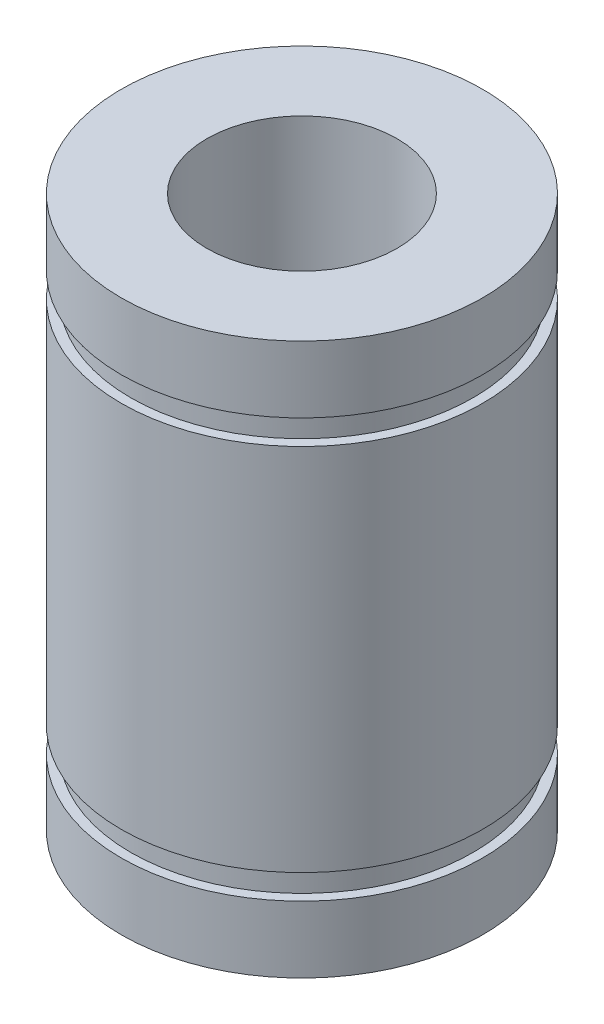
ISO-10303-21;
HEADER;
FILE_DESCRIPTION(('STEP AP214'),'2;1');
FILE_NAME('part.step','',(''),(''),'','','');
FILE_SCHEMA(('AUTOMOTIVE_DESIGN { 1 0 10303 214 1 1 1 1 }'));
ENDSEC;
DATA;
#1=APPLICATION_CONTEXT('core data for automotive mechanical design processes');
#2=APPLICATION_PROTOCOL_DEFINITION('international standard','automotive_design',2000,#1);
#3=PRODUCT_CONTEXT('',#1,'mechanical');
#4=PRODUCT('Part','Part','',(#3));
#5=PRODUCT_RELATED_PRODUCT_CATEGORY('part','',(#4));
#6=PRODUCT_DEFINITION_FORMATION('','',#4);
#7=PRODUCT_DEFINITION_CONTEXT('part definition',#1,'design');
#8=PRODUCT_DEFINITION('design','',#6,#7);
#9=PRODUCT_DEFINITION_SHAPE('','',#8);
#10=(LENGTH_UNIT() NAMED_UNIT(*) SI_UNIT(.MILLI.,.METRE.));
#11=(NAMED_UNIT(*) PLANE_ANGLE_UNIT() SI_UNIT($,.RADIAN.));
#12=(NAMED_UNIT(*) SI_UNIT($,.STERADIAN.) SOLID_ANGLE_UNIT());
#13=UNCERTAINTY_MEASURE_WITH_UNIT(LENGTH_MEASURE(1.E-05),#10,'distance_accuracy_value','');
#14=(GEOMETRIC_REPRESENTATION_CONTEXT(3) GLOBAL_UNCERTAINTY_ASSIGNED_CONTEXT((#13)) GLOBAL_UNIT_ASSIGNED_CONTEXT((#10,
#11,#12)) REPRESENTATION_CONTEXT('',''));
#15=CARTESIAN_POINT('',(0.,0.,0.));
#16=DIRECTION('',(0.,0.,1.));
#17=DIRECTION('',(1.,0.,0.));
#18=AXIS2_PLACEMENT_3D('',#15,#16,#17);
#19=CARTESIAN_POINT('',(0.,46.0446188340807,0.));
#20=DIRECTION('',(0.,1.,0.));
#21=DIRECTION('',(0.,0.,1.));
#22=AXIS2_PLACEMENT_3D('',#19,#20,#21);
#23=CYLINDRICAL_SURFACE('',#22,5.00000000000001);
#24=CARTESIAN_POINT('',(0.,-14.5,0.));
#25=DIRECTION('',(0.,1.,0.));
#26=DIRECTION('',(0.,0.,1.));
#27=AXIS2_PLACEMENT_3D('',#24,#25,#26);
#28=CIRCLE('',#27,5.00000000000001);
#29=CARTESIAN_POINT('',(0.,-14.5,5.00000000000001));
#30=VERTEX_POINT('',#29);
#31=EDGE_CURVE('E10',#30,#30,#28,.T.);
#32=ORIENTED_EDGE('',*,*,#31,.F.);
#33=EDGE_LOOP('',(#32));
#34=FACE_BOUND('',#33,.T.);
#35=CARTESIAN_POINT('',(0.,14.5,0.));
#36=DIRECTION('',(0.,1.,0.));
#37=DIRECTION('',(0.,0.,1.));
#38=AXIS2_PLACEMENT_3D('',#35,#36,#37);
#39=CIRCLE('',#38,5.00000000000001);
#40=CARTESIAN_POINT('',(0.,14.5,5.00000000000001));
#41=VERTEX_POINT('',#40);
#42=EDGE_CURVE('E70',#41,#41,#39,.T.);
#43=ORIENTED_EDGE('',*,*,#42,.T.);
#44=EDGE_LOOP('',(#43));
#45=FACE_BOUND('',#44,.T.);
#46=ADVANCED_FACE('F30',(#34,#45),#23,.F.);
#47=CARTESIAN_POINT('',(5.00000000000001,-14.5,0.));
#48=DIRECTION('',(0.,1.,0.));
#49=DIRECTION('',(0.,0.,1.));
#50=AXIS2_PLACEMENT_3D('',#47,#48,#49);
#51=PLANE('',#50);
#52=CARTESIAN_POINT('',(0.,-14.5,0.));
#53=DIRECTION('',(0.,1.,0.));
#54=DIRECTION('',(0.,0.,1.));
#55=AXIS2_PLACEMENT_3D('',#52,#53,#54);
#56=CIRCLE('',#55,9.50000000000001);
#57=CARTESIAN_POINT('',(0.,-14.5,9.50000000000001));
#58=VERTEX_POINT('',#57);
#59=EDGE_CURVE('E36',#58,#58,#56,.T.);
#60=ORIENTED_EDGE('',*,*,#59,.F.);
#61=EDGE_LOOP('',(#60));
#62=FACE_BOUND('',#61,.T.);
#63=ORIENTED_EDGE('',*,*,#31,.T.);
#64=EDGE_LOOP('',(#63));
#65=FACE_BOUND('',#64,.T.);
#66=ADVANCED_FACE('F131',(#62,#65),#51,.F.);
#67=CARTESIAN_POINT('',(0.,46.0446188340807,0.));
#68=DIRECTION('',(0.,1.,0.));
#69=DIRECTION('',(0.,0.,1.));
#70=AXIS2_PLACEMENT_3D('',#67,#68,#69);
#71=CYLINDRICAL_SURFACE('',#70,9.50000000000001);
#72=CARTESIAN_POINT('',(0.,-11.,0.));
#73=DIRECTION('',(0.,1.,0.));
#74=DIRECTION('',(0.,0.,1.));
#75=AXIS2_PLACEMENT_3D('',#72,#73,#74);
#76=CIRCLE('',#75,9.50000000000001);
#77=CARTESIAN_POINT('',(0.,-11.,9.50000000000001));
#78=VERTEX_POINT('',#77);
#79=EDGE_CURVE('E40',#78,#78,#76,.T.);
#80=ORIENTED_EDGE('',*,*,#79,.F.);
#81=EDGE_LOOP('',(#80));
#82=FACE_BOUND('',#81,.T.);
#83=ORIENTED_EDGE('',*,*,#59,.T.);
#84=EDGE_LOOP('',(#83));
#85=FACE_BOUND('',#84,.T.);
#86=ADVANCED_FACE('F126',(#82,#85),#71,.T.);
#87=CARTESIAN_POINT('',(9.50000000000001,-11.,0.));
#88=DIRECTION('',(0.,-1.,0.));
#89=DIRECTION('',(0.,0.,-1.));
#90=AXIS2_PLACEMENT_3D('',#87,#88,#89);
#91=PLANE('',#90);
#92=CARTESIAN_POINT('',(0.,-11.,0.));
#93=DIRECTION('',(0.,1.,0.));
#94=DIRECTION('',(0.,0.,1.));
#95=AXIS2_PLACEMENT_3D('',#92,#93,#94);
#96=CIRCLE('',#95,9.00000000000001);
#97=CARTESIAN_POINT('',(0.,-11.,9.00000000000001));
#98=VERTEX_POINT('',#97);
#99=EDGE_CURVE('E44',#98,#98,#96,.T.);
#100=ORIENTED_EDGE('',*,*,#99,.F.);
#101=EDGE_LOOP('',(#100));
#102=FACE_BOUND('',#101,.T.);
#103=ORIENTED_EDGE('',*,*,#79,.T.);
#104=EDGE_LOOP('',(#103));
#105=FACE_BOUND('',#104,.T.);
#106=ADVANCED_FACE('F120',(#102,#105),#91,.F.);
#107=CARTESIAN_POINT('',(0.,46.0446188340807,0.));
#108=DIRECTION('',(0.,1.,0.));
#109=DIRECTION('',(0.,0.,1.));
#110=AXIS2_PLACEMENT_3D('',#107,#108,#109);
#111=CYLINDRICAL_SURFACE('',#110,9.00000000000001);
#112=CARTESIAN_POINT('',(0.,-9.7,0.));
#113=DIRECTION('',(0.,1.,0.));
#114=DIRECTION('',(0.,0.,1.));
#115=AXIS2_PLACEMENT_3D('',#112,#113,#114);
#116=CIRCLE('',#115,9.00000000000001);
#117=CARTESIAN_POINT('',(0.,-9.7,9.00000000000001));
#118=VERTEX_POINT('',#117);
#119=EDGE_CURVE('E49',#118,#118,#116,.T.);
#120=ORIENTED_EDGE('',*,*,#119,.F.);
#121=EDGE_LOOP('',(#120));
#122=FACE_BOUND('',#121,.T.);
#123=ORIENTED_EDGE('',*,*,#99,.T.);
#124=EDGE_LOOP('',(#123));
#125=FACE_BOUND('',#124,.T.);
#126=ADVANCED_FACE('F114',(#122,#125),#111,.T.);
#127=CARTESIAN_POINT('',(9.50000000000001,-9.7,0.));
#128=DIRECTION('',(0.,1.,0.));
#129=DIRECTION('',(0.,0.,1.));
#130=AXIS2_PLACEMENT_3D('',#127,#128,#129);
#131=PLANE('',#130);
#132=CARTESIAN_POINT('',(0.,-9.7,0.));
#133=DIRECTION('',(0.,1.,0.));
#134=DIRECTION('',(0.,0.,1.));
#135=AXIS2_PLACEMENT_3D('',#132,#133,#134);
#136=CIRCLE('',#135,9.50000000000001);
#137=CARTESIAN_POINT('',(0.,-9.7,9.50000000000001));
#138=VERTEX_POINT('',#137);
#139=EDGE_CURVE('E52',#138,#138,#136,.T.);
#140=ORIENTED_EDGE('',*,*,#139,.F.);
#141=EDGE_LOOP('',(#140));
#142=FACE_BOUND('',#141,.T.);
#143=ORIENTED_EDGE('',*,*,#119,.T.);
#144=EDGE_LOOP('',(#143));
#145=FACE_BOUND('',#144,.T.);
#146=ADVANCED_FACE('F108',(#142,#145),#131,.F.);
#147=CARTESIAN_POINT('',(0.,46.0446188340807,0.));
#148=DIRECTION('',(0.,1.,0.));
#149=DIRECTION('',(0.,0.,1.));
#150=AXIS2_PLACEMENT_3D('',#147,#148,#149);
#151=CYLINDRICAL_SURFACE('',#150,9.50000000000001);
#152=CARTESIAN_POINT('',(0.,9.7,0.));
#153=DIRECTION('',(0.,1.,0.));
#154=DIRECTION('',(0.,0.,1.));
#155=AXIS2_PLACEMENT_3D('',#152,#153,#154);
#156=CIRCLE('',#155,9.50000000000001);
#157=CARTESIAN_POINT('',(0.,9.7,9.50000000000001));
#158=VERTEX_POINT('',#157);
#159=EDGE_CURVE('E55',#158,#158,#156,.T.);
#160=ORIENTED_EDGE('',*,*,#159,.F.);
#161=EDGE_LOOP('',(#160));
#162=FACE_BOUND('',#161,.T.);
#163=ORIENTED_EDGE('',*,*,#139,.T.);
#164=EDGE_LOOP('',(#163));
#165=FACE_BOUND('',#164,.T.);
#166=ADVANCED_FACE('F102',(#162,#165),#151,.T.);
#167=CARTESIAN_POINT('',(9.50000000000001,9.7,0.));
#168=DIRECTION('',(0.,-1.,0.));
#169=DIRECTION('',(0.,0.,-1.));
#170=AXIS2_PLACEMENT_3D('',#167,#168,#169);
#171=PLANE('',#170);
#172=CARTESIAN_POINT('',(0.,9.7,0.));
#173=DIRECTION('',(0.,1.,0.));
#174=DIRECTION('',(0.,0.,1.));
#175=AXIS2_PLACEMENT_3D('',#172,#173,#174);
#176=CIRCLE('',#175,9.);
#177=CARTESIAN_POINT('',(0.,9.7,9.));
#178=VERTEX_POINT('',#177);
#179=EDGE_CURVE('E58',#178,#178,#176,.T.);
#180=ORIENTED_EDGE('',*,*,#179,.F.);
#181=EDGE_LOOP('',(#180));
#182=FACE_BOUND('',#181,.T.);
#183=ORIENTED_EDGE('',*,*,#159,.T.);
#184=EDGE_LOOP('',(#183));
#185=FACE_BOUND('',#184,.T.);
#186=ADVANCED_FACE('F96',(#182,#185),#171,.F.);
#187=CARTESIAN_POINT('',(0.,46.0446188340807,0.));
#188=DIRECTION('',(0.,1.,0.));
#189=DIRECTION('',(0.,0.,1.));
#190=AXIS2_PLACEMENT_3D('',#187,#188,#189);
#191=CYLINDRICAL_SURFACE('',#190,9.00000000000001);
#192=CARTESIAN_POINT('',(0.,11.,0.));
#193=DIRECTION('',(0.,1.,0.));
#194=DIRECTION('',(0.,0.,1.));
#195=AXIS2_PLACEMENT_3D('',#192,#193,#194);
#196=CIRCLE('',#195,9.00000000000001);
#197=CARTESIAN_POINT('',(0.,11.,9.00000000000001));
#198=VERTEX_POINT('',#197);
#199=EDGE_CURVE('E61',#198,#198,#196,.T.);
#200=ORIENTED_EDGE('',*,*,#199,.F.);
#201=EDGE_LOOP('',(#200));
#202=FACE_BOUND('',#201,.T.);
#203=ORIENTED_EDGE('',*,*,#179,.T.);
#204=EDGE_LOOP('',(#203));
#205=FACE_BOUND('',#204,.T.);
#206=ADVANCED_FACE('F90',(#202,#205),#191,.T.);
#207=CARTESIAN_POINT('',(9.50000000000001,11.,0.));
#208=DIRECTION('',(0.,1.,0.));
#209=DIRECTION('',(0.,0.,1.));
#210=AXIS2_PLACEMENT_3D('',#207,#208,#209);
#211=PLANE('',#210);
#212=CARTESIAN_POINT('',(0.,11.,0.));
#213=DIRECTION('',(0.,1.,0.));
#214=DIRECTION('',(0.,0.,1.));
#215=AXIS2_PLACEMENT_3D('',#212,#213,#214);
#216=CIRCLE('',#215,9.50000000000001);
#217=CARTESIAN_POINT('',(0.,11.,9.50000000000001));
#218=VERTEX_POINT('',#217);
#219=EDGE_CURVE('E64',#218,#218,#216,.T.);
#220=ORIENTED_EDGE('',*,*,#219,.F.);
#221=EDGE_LOOP('',(#220));
#222=FACE_BOUND('',#221,.T.);
#223=ORIENTED_EDGE('',*,*,#199,.T.);
#224=EDGE_LOOP('',(#223));
#225=FACE_BOUND('',#224,.T.);
#226=ADVANCED_FACE('F84',(#222,#225),#211,.F.);
#227=CARTESIAN_POINT('',(0.,46.0446188340807,0.));
#228=DIRECTION('',(0.,1.,0.));
#229=DIRECTION('',(0.,0.,1.));
#230=AXIS2_PLACEMENT_3D('',#227,#228,#229);
#231=CYLINDRICAL_SURFACE('',#230,9.50000000000001);
#232=CARTESIAN_POINT('',(0.,14.5,0.));
#233=DIRECTION('',(0.,1.,0.));
#234=DIRECTION('',(0.,0.,1.));
#235=AXIS2_PLACEMENT_3D('',#232,#233,#234);
#236=CIRCLE('',#235,9.50000000000001);
#237=CARTESIAN_POINT('',(0.,14.5,9.50000000000001));
#238=VERTEX_POINT('',#237);
#239=EDGE_CURVE('E67',#238,#238,#236,.T.);
#240=ORIENTED_EDGE('',*,*,#239,.F.);
#241=EDGE_LOOP('',(#240));
#242=FACE_BOUND('',#241,.T.);
#243=ORIENTED_EDGE('',*,*,#219,.T.);
#244=EDGE_LOOP('',(#243));
#245=FACE_BOUND('',#244,.T.);
#246=ADVANCED_FACE('F78',(#242,#245),#231,.T.);
#247=CARTESIAN_POINT('',(5.00000000000001,14.5,0.));
#248=DIRECTION('',(0.,-1.,0.));
#249=DIRECTION('',(0.,0.,-1.));
#250=AXIS2_PLACEMENT_3D('',#247,#248,#249);
#251=PLANE('',#250);
#252=ORIENTED_EDGE('',*,*,#42,.F.);
#253=EDGE_LOOP('',(#252));
#254=FACE_BOUND('',#253,.T.);
#255=ORIENTED_EDGE('',*,*,#239,.T.);
#256=EDGE_LOOP('',(#255));
#257=FACE_BOUND('',#256,.T.);
#258=ADVANCED_FACE('F75',(#254,#257),#251,.F.);
#259=CLOSED_SHELL('',(#46,#66,#86,#106,#126,#146,#166,#186,#206,#226,#246,#258));
#260=MANIFOLD_SOLID_BREP('B2',#259);
#261=ADVANCED_BREP_SHAPE_REPRESENTATION('',(#18,#260),#14);
#262=SHAPE_DEFINITION_REPRESENTATION(#9,#261);
ENDSEC;
END-ISO-10303-21;
